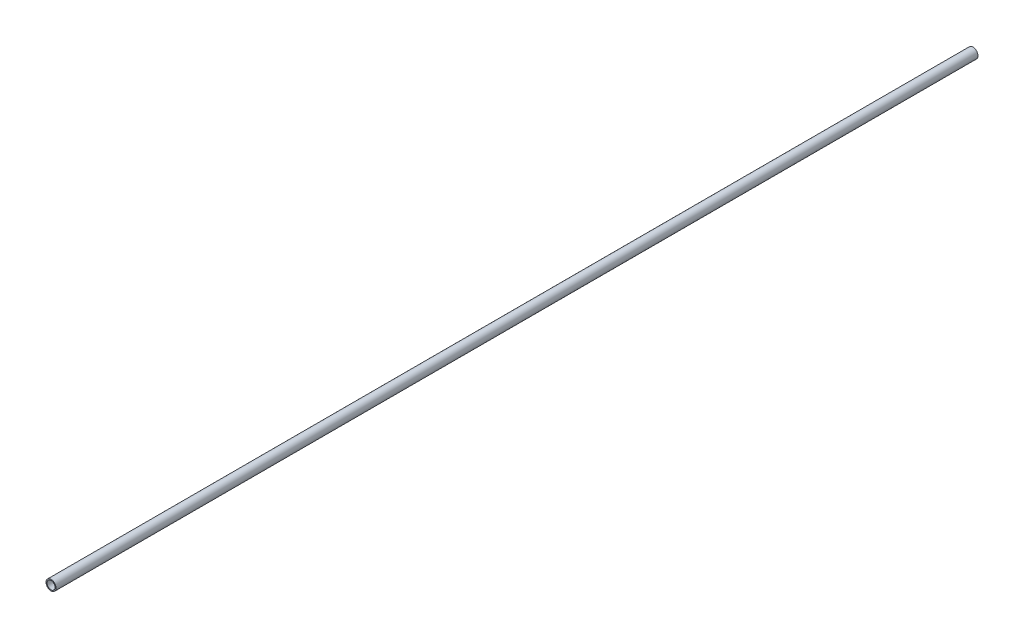
ISO-10303-21;
HEADER;
FILE_DESCRIPTION(('STEP AP214'),'2;1');
FILE_NAME('part.step','',(''),(''),'','','');
FILE_SCHEMA(('AUTOMOTIVE_DESIGN { 1 0 10303 214 1 1 1 1 }'));
ENDSEC;
DATA;
#1=APPLICATION_CONTEXT('core data for automotive mechanical design processes');
#2=APPLICATION_PROTOCOL_DEFINITION('international standard','automotive_design',2000,#1);
#3=PRODUCT_CONTEXT('',#1,'mechanical');
#4=PRODUCT('Part','Part','',(#3));
#5=PRODUCT_RELATED_PRODUCT_CATEGORY('part','',(#4));
#6=PRODUCT_DEFINITION_FORMATION('','',#4);
#7=PRODUCT_DEFINITION_CONTEXT('part definition',#1,'design');
#8=PRODUCT_DEFINITION('design','',#6,#7);
#9=PRODUCT_DEFINITION_SHAPE('','',#8);
#10=(LENGTH_UNIT() NAMED_UNIT(*) SI_UNIT(.MILLI.,.METRE.));
#11=(NAMED_UNIT(*) PLANE_ANGLE_UNIT() SI_UNIT($,.RADIAN.));
#12=(NAMED_UNIT(*) SI_UNIT($,.STERADIAN.) SOLID_ANGLE_UNIT());
#13=UNCERTAINTY_MEASURE_WITH_UNIT(LENGTH_MEASURE(1.E-05),#10,'distance_accuracy_value','');
#14=(GEOMETRIC_REPRESENTATION_CONTEXT(3) GLOBAL_UNCERTAINTY_ASSIGNED_CONTEXT((#13)) GLOBAL_UNIT_ASSIGNED_CONTEXT((#10,
#11,#12)) REPRESENTATION_CONTEXT('',''));
#15=CARTESIAN_POINT('',(0.,0.,0.));
#16=DIRECTION('',(0.,0.,1.));
#17=DIRECTION('',(1.,0.,0.));
#18=AXIS2_PLACEMENT_3D('',#15,#16,#17);
#19=CARTESIAN_POINT('',(0.,0.,457.2));
#20=DIRECTION('',(0.,0.,1.));
#21=DIRECTION('',(1.,0.,0.));
#22=AXIS2_PLACEMENT_3D('',#19,#20,#21);
#23=PLANE('',#22);
#24=CARTESIAN_POINT('',(0.,0.,457.2));
#25=DIRECTION('',(0.,0.,1.));
#26=DIRECTION('',(1.,0.,0.));
#27=AXIS2_PLACEMENT_3D('',#24,#25,#26);
#28=CIRCLE('',#27,5.);
#29=CARTESIAN_POINT('',(5.,0.,457.2));
#30=VERTEX_POINT('',#29);
#31=EDGE_CURVE('E10',#30,#30,#28,.T.);
#32=ORIENTED_EDGE('',*,*,#31,.T.);
#33=EDGE_LOOP('',(#32));
#34=FACE_BOUND('',#33,.T.);
#35=CARTESIAN_POINT('',(0.,0.,457.2));
#36=DIRECTION('',(0.,0.,1.));
#37=DIRECTION('',(1.,0.,0.));
#38=AXIS2_PLACEMENT_3D('',#35,#36,#37);
#39=CIRCLE('',#38,4.);
#40=CARTESIAN_POINT('',(4.,0.,457.2));
#41=VERTEX_POINT('',#40);
#42=EDGE_CURVE('E50',#41,#41,#39,.T.);
#43=ORIENTED_EDGE('',*,*,#42,.F.);
#44=EDGE_LOOP('',(#43));
#45=FACE_BOUND('',#44,.T.);
#46=ADVANCED_FACE('F37',(#34,#45),#23,.T.);
#47=CARTESIAN_POINT('',(0.,0.,-457.2));
#48=DIRECTION('',(0.,0.,1.));
#49=DIRECTION('',(1.,0.,0.));
#50=AXIS2_PLACEMENT_3D('',#47,#48,#49);
#51=PLANE('',#50);
#52=CARTESIAN_POINT('',(0.,0.,-457.2));
#53=DIRECTION('',(0.,0.,1.));
#54=DIRECTION('',(1.,0.,0.));
#55=AXIS2_PLACEMENT_3D('',#52,#53,#54);
#56=CIRCLE('',#55,5.);
#57=CARTESIAN_POINT('',(5.,0.,-457.2));
#58=VERTEX_POINT('',#57);
#59=EDGE_CURVE('E41',#58,#58,#56,.T.);
#60=ORIENTED_EDGE('',*,*,#59,.F.);
#61=EDGE_LOOP('',(#60));
#62=FACE_BOUND('',#61,.T.);
#63=CARTESIAN_POINT('',(0.,0.,-457.2));
#64=DIRECTION('',(0.,0.,1.));
#65=DIRECTION('',(1.,0.,0.));
#66=AXIS2_PLACEMENT_3D('',#63,#64,#65);
#67=CIRCLE('',#66,4.);
#68=CARTESIAN_POINT('',(4.,0.,-457.2));
#69=VERTEX_POINT('',#68);
#70=EDGE_CURVE('E52',#69,#69,#67,.T.);
#71=ORIENTED_EDGE('',*,*,#70,.T.);
#72=EDGE_LOOP('',(#71));
#73=FACE_BOUND('',#72,.T.);
#74=ADVANCED_FACE('F64',(#62,#73),#51,.F.);
#75=CARTESIAN_POINT('',(0.,0.,457.2));
#76=DIRECTION('',(0.,0.,-1.));
#77=DIRECTION('',(-1.,0.,0.));
#78=AXIS2_PLACEMENT_3D('',#75,#76,#77);
#79=CYLINDRICAL_SURFACE('',#78,5.);
#80=ORIENTED_EDGE('',*,*,#31,.F.);
#81=EDGE_LOOP('',(#80));
#82=FACE_BOUND('',#81,.T.);
#83=ORIENTED_EDGE('',*,*,#59,.T.);
#84=EDGE_LOOP('',(#83));
#85=FACE_BOUND('',#84,.T.);
#86=ADVANCED_FACE('F39',(#82,#85),#79,.T.);
#87=CARTESIAN_POINT('',(0.,0.,457.2));
#88=DIRECTION('',(0.,0.,-1.));
#89=DIRECTION('',(-1.,0.,0.));
#90=AXIS2_PLACEMENT_3D('',#87,#88,#89);
#91=CYLINDRICAL_SURFACE('',#90,4.);
#92=ORIENTED_EDGE('',*,*,#42,.T.);
#93=EDGE_LOOP('',(#92));
#94=FACE_BOUND('',#93,.T.);
#95=ORIENTED_EDGE('',*,*,#70,.F.);
#96=EDGE_LOOP('',(#95));
#97=FACE_BOUND('',#96,.T.);
#98=ADVANCED_FACE('F60',(#94,#97),#91,.F.);
#99=CLOSED_SHELL('',(#46,#74,#86,#98));
#100=MANIFOLD_SOLID_BREP('B2',#99);
#101=ADVANCED_BREP_SHAPE_REPRESENTATION('',(#18,#100),#14);
#102=SHAPE_DEFINITION_REPRESENTATION(#9,#101);
ENDSEC;
END-ISO-10303-21;
